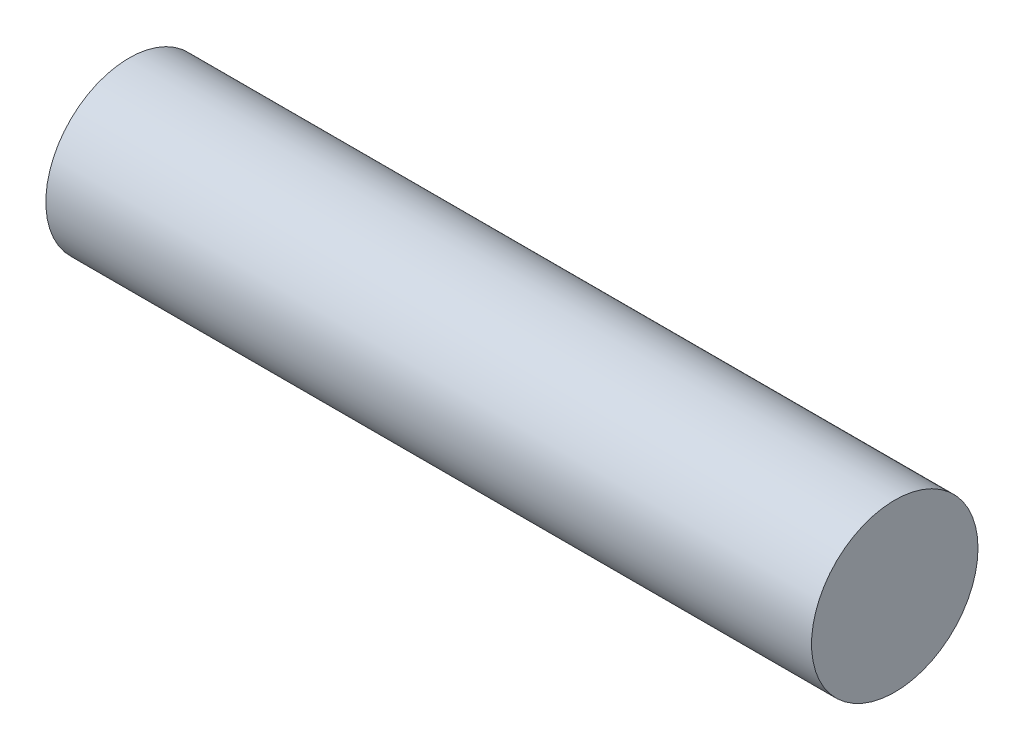
ISO-10303-21;
HEADER;
FILE_DESCRIPTION(('STEP AP214'),'2;1');
FILE_NAME('part.step','',(''),(''),'','','');
FILE_SCHEMA(('AUTOMOTIVE_DESIGN { 1 0 10303 214 1 1 1 1 }'));
ENDSEC;
DATA;
#1=APPLICATION_CONTEXT('core data for automotive mechanical design processes');
#2=APPLICATION_PROTOCOL_DEFINITION('international standard','automotive_design',2000,#1);
#3=PRODUCT_CONTEXT('',#1,'mechanical');
#4=PRODUCT('Part','Part','',(#3));
#5=PRODUCT_RELATED_PRODUCT_CATEGORY('part','',(#4));
#6=PRODUCT_DEFINITION_FORMATION('','',#4);
#7=PRODUCT_DEFINITION_CONTEXT('part definition',#1,'design');
#8=PRODUCT_DEFINITION('design','',#6,#7);
#9=PRODUCT_DEFINITION_SHAPE('','',#8);
#10=(LENGTH_UNIT() NAMED_UNIT(*) SI_UNIT(.MILLI.,.METRE.));
#11=(NAMED_UNIT(*) PLANE_ANGLE_UNIT() SI_UNIT($,.RADIAN.));
#12=(NAMED_UNIT(*) SI_UNIT($,.STERADIAN.) SOLID_ANGLE_UNIT());
#13=UNCERTAINTY_MEASURE_WITH_UNIT(LENGTH_MEASURE(1.E-05),#10,'distance_accuracy_value','');
#14=(GEOMETRIC_REPRESENTATION_CONTEXT(3) GLOBAL_UNCERTAINTY_ASSIGNED_CONTEXT((#13)) GLOBAL_UNIT_ASSIGNED_CONTEXT((#10,
#11,#12)) REPRESENTATION_CONTEXT('',''));
#15=CARTESIAN_POINT('',(0.,0.,0.));
#16=DIRECTION('',(0.,0.,1.));
#17=DIRECTION('',(1.,0.,0.));
#18=AXIS2_PLACEMENT_3D('',#15,#16,#17);
#19=CARTESIAN_POINT('',(146.05,0.,0.));
#20=DIRECTION('',(-1.,0.,0.));
#21=DIRECTION('',(0.,0.,1.));
#22=AXIS2_PLACEMENT_3D('',#19,#20,#21);
#23=CYLINDRICAL_SURFACE('',#22,15.875);
#24=CARTESIAN_POINT('',(146.05,0.,0.));
#25=DIRECTION('',(1.,0.,0.));
#26=DIRECTION('',(0.,0.,-1.));
#27=AXIS2_PLACEMENT_3D('',#24,#25,#26);
#28=CIRCLE('',#27,15.875);
#29=CARTESIAN_POINT('',(146.05,0.,-15.875));
#30=VERTEX_POINT('',#29);
#31=EDGE_CURVE('E10',#30,#30,#28,.T.);
#32=ORIENTED_EDGE('',*,*,#31,.F.);
#33=EDGE_LOOP('',(#32));
#34=FACE_BOUND('',#33,.T.);
#35=CARTESIAN_POINT('',(0.,0.,0.));
#36=DIRECTION('',(1.,0.,0.));
#37=DIRECTION('',(0.,0.,-1.));
#38=AXIS2_PLACEMENT_3D('',#35,#36,#37);
#39=CIRCLE('',#38,15.875);
#40=CARTESIAN_POINT('',(0.,0.,-15.875));
#41=VERTEX_POINT('',#40);
#42=EDGE_CURVE('E36',#41,#41,#39,.T.);
#43=ORIENTED_EDGE('',*,*,#42,.T.);
#44=EDGE_LOOP('',(#43));
#45=FACE_BOUND('',#44,.T.);
#46=ADVANCED_FACE('F33',(#34,#45),#23,.T.);
#47=CARTESIAN_POINT('',(146.05,0.,0.));
#48=DIRECTION('',(1.,0.,0.));
#49=DIRECTION('',(0.,0.,-1.));
#50=AXIS2_PLACEMENT_3D('',#47,#48,#49);
#51=PLANE('',#50);
#52=ORIENTED_EDGE('',*,*,#31,.T.);
#53=EDGE_LOOP('',(#52));
#54=FACE_BOUND('',#53,.T.);
#55=ADVANCED_FACE('F48',(#54),#51,.T.);
#56=CARTESIAN_POINT('',(0.,0.,0.));
#57=DIRECTION('',(1.,0.,0.));
#58=DIRECTION('',(0.,0.,-1.));
#59=AXIS2_PLACEMENT_3D('',#56,#57,#58);
#60=PLANE('',#59);
#61=ORIENTED_EDGE('',*,*,#42,.F.);
#62=EDGE_LOOP('',(#61));
#63=FACE_BOUND('',#62,.T.);
#64=ADVANCED_FACE('F46',(#63),#60,.F.);
#65=CLOSED_SHELL('',(#46,#55,#64));
#66=MANIFOLD_SOLID_BREP('B2',#65);
#67=ADVANCED_BREP_SHAPE_REPRESENTATION('',(#18,#66),#14);
#68=SHAPE_DEFINITION_REPRESENTATION(#9,#67);
ENDSEC;
END-ISO-10303-21;
